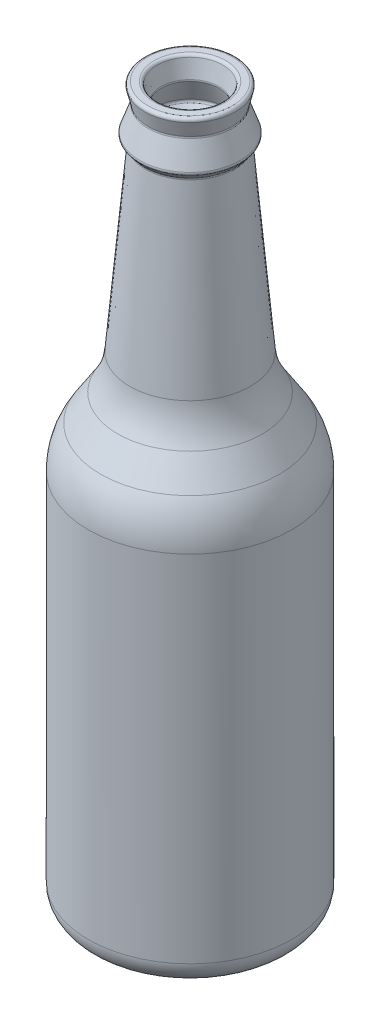
ISO-10303-21;
HEADER;
FILE_DESCRIPTION(('STEP AP214'),'2;1');
FILE_NAME('part.step','',(''),(''),'','','');
FILE_SCHEMA(('AUTOMOTIVE_DESIGN { 1 0 10303 214 1 1 1 1 }'));
ENDSEC;
DATA;
#1=APPLICATION_CONTEXT('core data for automotive mechanical design processes');
#2=APPLICATION_PROTOCOL_DEFINITION('international standard','automotive_design',2000,#1);
#3=PRODUCT_CONTEXT('',#1,'mechanical');
#4=PRODUCT('Part','Part','',(#3));
#5=PRODUCT_RELATED_PRODUCT_CATEGORY('part','',(#4));
#6=PRODUCT_DEFINITION_FORMATION('','',#4);
#7=PRODUCT_DEFINITION_CONTEXT('part definition',#1,'design');
#8=PRODUCT_DEFINITION('design','',#6,#7);
#9=PRODUCT_DEFINITION_SHAPE('','',#8);
#10=(LENGTH_UNIT() NAMED_UNIT(*) SI_UNIT(.MILLI.,.METRE.));
#11=(NAMED_UNIT(*) PLANE_ANGLE_UNIT() SI_UNIT($,.RADIAN.));
#12=(NAMED_UNIT(*) SI_UNIT($,.STERADIAN.) SOLID_ANGLE_UNIT());
#13=UNCERTAINTY_MEASURE_WITH_UNIT(LENGTH_MEASURE(1.E-05),#10,'distance_accuracy_value','');
#14=(GEOMETRIC_REPRESENTATION_CONTEXT(3) GLOBAL_UNCERTAINTY_ASSIGNED_CONTEXT((#13)) GLOBAL_UNIT_ASSIGNED_CONTEXT((#10,
#11,#12)) REPRESENTATION_CONTEXT('',''));
#15=CARTESIAN_POINT('',(0.,0.,0.));
#16=DIRECTION('',(0.,0.,1.));
#17=DIRECTION('',(1.,0.,0.));
#18=AXIS2_PLACEMENT_3D('',#15,#16,#17);
#19=CARTESIAN_POINT('',(0.,0.,0.));
#20=DIRECTION('',(0.,-1.,0.));
#21=DIRECTION('',(0.,0.,-1.));
#22=AXIS2_PLACEMENT_3D('',#19,#20,#21);
#23=PLANE('',#22);
#24=CARTESIAN_POINT('',(0.,0.,0.));
#25=DIRECTION('',(0.,-1.,0.));
#26=DIRECTION('',(0.,0.,-1.));
#27=AXIS2_PLACEMENT_3D('',#24,#25,#26);
#28=CIRCLE('',#27,25.1705232871505);
#29=CARTESIAN_POINT('',(0.,0.,-25.1705232871505));
#30=VERTEX_POINT('',#29);
#31=EDGE_CURVE('E99',#30,#30,#28,.T.);
#32=ORIENTED_EDGE('',*,*,#31,.T.);
#33=EDGE_LOOP('',(#32));
#34=FACE_BOUND('',#33,.T.);
#35=ADVANCED_FACE('F31',(#34),#23,.T.);
#36=CARTESIAN_POINT('',(0.,7.62038994454006,0.));
#37=DIRECTION('',(0.,-1.,0.));
#38=DIRECTION('',(0.,0.,-1.));
#39=AXIS2_PLACEMENT_3D('',#36,#37,#38);
#40=TOROIDAL_SURFACE('',#39,25.1705232871505,7.62038994454006);
#41=CARTESIAN_POINT('',(0.,7.62038994454006,0.));
#42=DIRECTION('',(0.,-1.,0.));
#43=DIRECTION('',(0.,0.,-1.));
#44=AXIS2_PLACEMENT_3D('',#41,#42,#43);
#45=CIRCLE('',#44,32.7909132316906);
#46=CARTESIAN_POINT('',(0.,7.62038994454006,-32.7909132316906));
#47=VERTEX_POINT('',#46);
#48=EDGE_CURVE('E102',#47,#47,#45,.T.);
#49=ORIENTED_EDGE('',*,*,#48,.T.);
#50=EDGE_LOOP('',(#49));
#51=FACE_BOUND('',#50,.T.);
#52=ORIENTED_EDGE('',*,*,#31,.F.);
#53=EDGE_LOOP('',(#52));
#54=FACE_BOUND('',#53,.T.);
#55=ADVANCED_FACE('F135',(#51,#54),#40,.T.);
#56=CARTESIAN_POINT('',(0.,0.,0.));
#57=DIRECTION('',(0.,-1.,0.));
#58=DIRECTION('',(0.,0.,-1.));
#59=AXIS2_PLACEMENT_3D('',#56,#57,#58);
#60=CYLINDRICAL_SURFACE('',#59,32.7909132316906);
#61=CARTESIAN_POINT('',(0.,121.979376149787,0.));
#62=DIRECTION('',(0.,1.,0.));
#63=DIRECTION('',(0.,0.,1.));
#64=AXIS2_PLACEMENT_3D('',#61,#62,#63);
#65=CIRCLE('',#64,32.7909132316906);
#66=CARTESIAN_POINT('',(0.,121.979376149787,32.7909132316906));
#67=VERTEX_POINT('',#66);
#68=EDGE_CURVE('E87',#67,#67,#65,.F.);
#69=ORIENTED_EDGE('',*,*,#68,.T.);
#70=EDGE_LOOP('',(#69));
#71=FACE_BOUND('',#70,.T.);
#72=ORIENTED_EDGE('',*,*,#48,.F.);
#73=EDGE_LOOP('',(#72));
#74=FACE_BOUND('',#73,.T.);
#75=ADVANCED_FACE('F141',(#71,#74),#60,.T.);
#76=CARTESIAN_POINT('',(0.,129.326876862975,0.));
#77=DIRECTION('',(0.,-1.,0.));
#78=DIRECTION('',(0.,0.,-1.));
#79=AXIS2_PLACEMENT_3D('',#76,#77,#78);
#80=CONICAL_SURFACE('',#79,32.7909132316906,0.571702275410155);
#81=CARTESIAN_POINT('',(0.,144.025421411682,0.));
#82=DIRECTION('',(0.,-1.,0.));
#83=DIRECTION('',(0.,0.,-1.));
#84=AXIS2_PLACEMENT_3D('',#81,#82,#83);
#85=CIRCLE('',#84,23.3342692233583);
#86=CARTESIAN_POINT('',(0.,144.025421411682,-23.3342692233583));
#87=VERTEX_POINT('',#86);
#88=EDGE_CURVE('E93',#87,#87,#85,.T.);
#89=ORIENTED_EDGE('',*,*,#88,.T.);
#90=EDGE_LOOP('',(#89));
#91=FACE_BOUND('',#90,.T.);
#92=CARTESIAN_POINT('',(0.,135.505986487605,0.));
#93=DIRECTION('',(0.,1.,0.));
#94=DIRECTION('',(0.,0.,1.));
#95=AXIS2_PLACEMENT_3D('',#92,#93,#94);
#96=CIRCLE('',#95,28.8154420675253);
#97=CARTESIAN_POINT('',(0.,135.505986487605,28.8154420675253));
#98=VERTEX_POINT('',#97);
#99=EDGE_CURVE('E96',#98,#98,#96,.T.);
#100=ORIENTED_EDGE('',*,*,#99,.T.);
#101=EDGE_LOOP('',(#100));
#102=FACE_BOUND('',#101,.T.);
#103=ADVANCED_FACE('F204',(#91,#102),#80,.T.);
#104=CARTESIAN_POINT('',(0.,149.216732243767,0.));
#105=DIRECTION('',(0.,-1.,0.));
#106=DIRECTION('',(0.,0.,-1.));
#107=AXIS2_PLACEMENT_3D('',#104,#105,#106);
#108=CONICAL_SURFACE('',#107,19.9943209507284,0.0875526867530574);
#109=CARTESIAN_POINT('',(0.,213.401447548994,0.));
#110=DIRECTION('',(0.,-1.,0.));
#111=DIRECTION('',(0.,0.,-1.));
#112=AXIS2_PLACEMENT_3D('',#109,#110,#111);
#113=CIRCLE('',#112,14.3603736918307);
#114=CARTESIAN_POINT('',(0.,213.401447548994,-14.3603736918307));
#115=VERTEX_POINT('',#114);
#116=EDGE_CURVE('E10',#115,#115,#113,.T.);
#117=ORIENTED_EDGE('',*,*,#116,.T.);
#118=EDGE_LOOP('',(#117));
#119=FACE_BOUND('',#118,.T.);
#120=CARTESIAN_POINT('',(0.,155.366009895557,0.));
#121=DIRECTION('',(0.,-1.,0.));
#122=DIRECTION('',(0.,0.,-1.));
#123=AXIS2_PLACEMENT_3D('',#120,#121,#122);
#124=CIRCLE('',#123,19.4545552790143);
#125=CARTESIAN_POINT('',(0.,155.366009895557,-19.4545552790143));
#126=VERTEX_POINT('',#125);
#127=EDGE_CURVE('E90',#126,#126,#124,.F.);
#128=ORIENTED_EDGE('',*,*,#127,.T.);
#129=EDGE_LOOP('',(#128));
#130=FACE_BOUND('',#129,.T.);
#131=ADVANCED_FACE('F199',(#119,#130),#108,.T.);
#132=CARTESIAN_POINT('',(0.,213.814074553801,0.));
#133=DIRECTION('',(0.,1.,0.));
#134=DIRECTION('',(0.,0.,1.));
#135=AXIS2_PLACEMENT_3D('',#132,#133,#134);
#136=CONICAL_SURFACE('',#135,14.3241544958488,0.697845476644383);
#137=CARTESIAN_POINT('',(0.,215.81799768994,0.));
#138=DIRECTION('',(0.,-1.,0.));
#139=DIRECTION('',(0.,0.,-1.));
#140=AXIS2_PLACEMENT_3D('',#137,#138,#139);
#141=CIRCLE('',#140,16.0046684790407);
#142=CARTESIAN_POINT('',(0.,215.81799768994,-16.0046684790407));
#143=VERTEX_POINT('',#142);
#144=EDGE_CURVE('E38',#143,#143,#141,.T.);
#145=ORIENTED_EDGE('',*,*,#144,.T.);
#146=EDGE_LOOP('',(#145));
#147=FACE_BOUND('',#146,.T.);
#148=CARTESIAN_POINT('',(0.,214.131456746089,0.));
#149=DIRECTION('',(0.,1.,0.));
#150=DIRECTION('',(0.,0.,1.));
#151=AXIS2_PLACEMENT_3D('',#148,#149,#150);
#152=CIRCLE('',#151,14.5903150099608);
#153=CARTESIAN_POINT('',(0.,214.131456746089,14.5903150099608));
#154=VERTEX_POINT('',#153);
#155=EDGE_CURVE('E42',#154,#154,#152,.T.);
#156=ORIENTED_EDGE('',*,*,#155,.T.);
#157=EDGE_LOOP('',(#156));
#158=FACE_BOUND('',#157,.T.);
#159=ADVANCED_FACE('F190',(#147,#158),#136,.T.);
#160=CARTESIAN_POINT('',(0.,216.255041385768,0.));
#161=DIRECTION('',(0.,-1.,0.));
#162=DIRECTION('',(0.,0.,-1.));
#163=AXIS2_PLACEMENT_3D('',#160,#161,#162);
#164=CONICAL_SURFACE('',#163,16.3711785656098,0.338869733029061);
#165=CARTESIAN_POINT('',(0.,224.356302094381,0.));
#166=DIRECTION('',(0.,-1.,0.));
#167=DIRECTION('',(0.,0.,-1.));
#168=AXIS2_PLACEMENT_3D('',#165,#166,#167);
#169=CIRCLE('',#168,13.5157621304972);
#170=CARTESIAN_POINT('',(0.,224.356302094381,-13.5157621304972));
#171=VERTEX_POINT('',#170);
#172=EDGE_CURVE('E46',#171,#171,#169,.T.);
#173=ORIENTED_EDGE('',*,*,#172,.T.);
#174=EDGE_LOOP('',(#173));
#175=FACE_BOUND('',#174,.T.);
#176=CARTESIAN_POINT('',(0.,216.79298732777,0.));
#177=DIRECTION('',(0.,1.,0.));
#178=DIRECTION('',(0.,0.,1.));
#179=AXIS2_PLACEMENT_3D('',#176,#177,#178);
#180=CIRCLE('',#179,16.1815710786712);
#181=CARTESIAN_POINT('',(0.,216.79298732777,16.1815710786712));
#182=VERTEX_POINT('',#181);
#183=EDGE_CURVE('E51',#182,#182,#180,.T.);
#184=ORIENTED_EDGE('',*,*,#183,.T.);
#185=EDGE_LOOP('',(#184));
#186=FACE_BOUND('',#185,.T.);
#187=ADVANCED_FACE('F188',(#175,#186),#164,.T.);
#188=CARTESIAN_POINT('',(0.,224.634729952167,0.));
#189=DIRECTION('',(0.,1.,0.));
#190=DIRECTION('',(0.,0.,1.));
#191=AXIS2_PLACEMENT_3D('',#188,#189,#190);
#192=CONICAL_SURFACE('',#191,13.4176258638456,0.235255330329999);
#193=CARTESIAN_POINT('',(0.,229.562736891709,0.));
#194=DIRECTION('',(0.,-1.,0.));
#195=DIRECTION('',(0.,0.,-1.));
#196=AXIS2_PLACEMENT_3D('',#193,#194,#195);
#197=CIRCLE('',#196,14.5988380169024);
#198=CARTESIAN_POINT('',(0.,229.562736891709,-14.5988380169024));
#199=VERTEX_POINT('',#198);
#200=EDGE_CURVE('E54',#199,#199,#197,.T.);
#201=ORIENTED_EDGE('',*,*,#200,.T.);
#202=EDGE_LOOP('',(#201));
#203=FACE_BOUND('',#202,.T.);
#204=CARTESIAN_POINT('',(0.,224.921814699601,0.));
#205=DIRECTION('',(0.,1.,0.));
#206=DIRECTION('',(0.,0.,1.));
#207=AXIS2_PLACEMENT_3D('',#204,#205,#206);
#208=CIRCLE('',#207,13.4864382654486);
#209=CARTESIAN_POINT('',(0.,224.921814699601,13.4864382654486));
#210=VERTEX_POINT('',#209);
#211=EDGE_CURVE('E57',#210,#210,#208,.T.);
#212=ORIENTED_EDGE('',*,*,#211,.T.);
#213=EDGE_LOOP('',(#212));
#214=FACE_BOUND('',#213,.T.);
#215=ADVANCED_FACE('F131',(#203,#214),#192,.T.);
#216=CARTESIAN_POINT('',(14.8944022147277,230.795828182036,0.));
#217=DIRECTION('',(0.,1.,0.));
#218=DIRECTION('',(0.,0.,1.));
#219=AXIS2_PLACEMENT_3D('',#216,#217,#218);
#220=PLANE('',#219);
#221=CARTESIAN_POINT('',(0.,230.795828182036,0.));
#222=DIRECTION('',(0.,1.,0.));
#223=DIRECTION('',(0.,0.,1.));
#224=AXIS2_PLACEMENT_3D('',#221,#222,#223);
#225=CIRCLE('',#224,11.5697324220468);
#226=CARTESIAN_POINT('',(0.,230.795828182036,11.5697324220468));
#227=VERTEX_POINT('',#226);
#228=EDGE_CURVE('E60',#227,#227,#225,.F.);
#229=ORIENTED_EDGE('',*,*,#228,.T.);
#230=EDGE_LOOP('',(#229));
#231=FACE_BOUND('',#230,.T.);
#232=CARTESIAN_POINT('',(0.,230.795828182036,0.));
#233=DIRECTION('',(0.,1.,0.));
#234=DIRECTION('',(0.,0.,1.));
#235=AXIS2_PLACEMENT_3D('',#232,#233,#234);
#236=CIRCLE('',#235,13.6263831591462);
#237=CARTESIAN_POINT('',(0.,230.795828182036,13.6263831591462));
#238=VERTEX_POINT('',#237);
#239=EDGE_CURVE('E63',#238,#238,#236,.T.);
#240=ORIENTED_EDGE('',*,*,#239,.T.);
#241=EDGE_LOOP('',(#240));
#242=FACE_BOUND('',#241,.T.);
#243=ADVANCED_FACE('F122',(#231,#242),#220,.T.);
#244=CARTESIAN_POINT('',(0.,4.,0.));
#245=DIRECTION('',(0.,-1.,0.));
#246=DIRECTION('',(0.,0.,-1.));
#247=AXIS2_PLACEMENT_3D('',#244,#245,#246);
#248=PLANE('',#247);
#249=CARTESIAN_POINT('',(0.,4.,0.));
#250=DIRECTION('',(0.,-1.,0.));
#251=DIRECTION('',(0.,0.,-1.));
#252=AXIS2_PLACEMENT_3D('',#249,#250,#251);
#253=CIRCLE('',#252,25.1705232871505);
#254=CARTESIAN_POINT('',(0.,4.,-25.1705232871505));
#255=VERTEX_POINT('',#254);
#256=EDGE_CURVE('E105',#255,#255,#253,.T.);
#257=ORIENTED_EDGE('',*,*,#256,.F.);
#258=EDGE_LOOP('',(#257));
#259=FACE_BOUND('',#258,.T.);
#260=ADVANCED_FACE('F120',(#259),#248,.F.);
#261=CARTESIAN_POINT('',(0.,7.62038994454006,0.));
#262=DIRECTION('',(0.,-1.,0.));
#263=DIRECTION('',(0.,0.,-1.));
#264=AXIS2_PLACEMENT_3D('',#261,#262,#263);
#265=TOROIDAL_SURFACE('',#264,25.1705232871505,3.62038994454006);
#266=CARTESIAN_POINT('',(0.,7.62038994454006,0.));
#267=DIRECTION('',(0.,-1.,0.));
#268=DIRECTION('',(0.,0.,-1.));
#269=AXIS2_PLACEMENT_3D('',#266,#267,#268);
#270=CIRCLE('',#269,28.7909132316906);
#271=CARTESIAN_POINT('',(0.,7.62038994454006,-28.7909132316906));
#272=VERTEX_POINT('',#271);
#273=EDGE_CURVE('E112',#272,#272,#270,.T.);
#274=ORIENTED_EDGE('',*,*,#273,.F.);
#275=EDGE_LOOP('',(#274));
#276=FACE_BOUND('',#275,.T.);
#277=ORIENTED_EDGE('',*,*,#256,.T.);
#278=EDGE_LOOP('',(#277));
#279=FACE_BOUND('',#278,.T.);
#280=ADVANCED_FACE('F118',(#276,#279),#265,.F.);
#281=CARTESIAN_POINT('',(0.,0.,0.));
#282=DIRECTION('',(0.,-1.,0.));
#283=DIRECTION('',(0.,0.,-1.));
#284=AXIS2_PLACEMENT_3D('',#281,#282,#283);
#285=CYLINDRICAL_SURFACE('',#284,28.7909132316906);
#286=CARTESIAN_POINT('',(0.,128.151276748865,0.));
#287=DIRECTION('',(0.,-1.,0.));
#288=DIRECTION('',(0.,0.,-1.));
#289=AXIS2_PLACEMENT_3D('',#286,#287,#288);
#290=CIRCLE('',#289,28.7909132316906);
#291=CARTESIAN_POINT('',(0.,128.151276748865,-28.7909132316906));
#292=VERTEX_POINT('',#291);
#293=EDGE_CURVE('E109',#292,#292,#290,.T.);
#294=ORIENTED_EDGE('',*,*,#293,.F.);
#295=EDGE_LOOP('',(#294));
#296=FACE_BOUND('',#295,.T.);
#297=ORIENTED_EDGE('',*,*,#273,.T.);
#298=EDGE_LOOP('',(#297));
#299=FACE_BOUND('',#298,.T.);
#300=ADVANCED_FACE('F128',(#296,#299),#285,.F.);
#301=CARTESIAN_POINT('',(0.,127.162619208924,0.));
#302=DIRECTION('',(0.,-1.,0.));
#303=DIRECTION('',(0.,0.,-1.));
#304=AXIS2_PLACEMENT_3D('',#301,#302,#303);
#305=CONICAL_SURFACE('',#304,29.426988617957,0.571702275410155);
#306=CARTESIAN_POINT('',(0.,147.883084322849,0.));
#307=DIRECTION('',(0.,-1.,0.));
#308=DIRECTION('',(0.,0.,-1.));
#309=AXIS2_PLACEMENT_3D('',#306,#307,#308);
#310=CIRCLE('',#309,16.096004613374);
#311=CARTESIAN_POINT('',(0.,147.883084322849,-16.096004613374));
#312=VERTEX_POINT('',#311);
#313=EDGE_CURVE('E106',#312,#312,#310,.T.);
#314=ORIENTED_EDGE('',*,*,#313,.F.);
#315=EDGE_LOOP('',(#314));
#316=FACE_BOUND('',#315,.T.);
#317=ORIENTED_EDGE('',*,*,#293,.T.);
#318=EDGE_LOOP('',(#317));
#319=FACE_BOUND('',#318,.T.);
#320=ADVANCED_FACE('F262',(#316,#319),#305,.F.);
#321=CARTESIAN_POINT('',(0.,148.866968747136,0.));
#322=DIRECTION('',(0.,-1.,0.));
#323=DIRECTION('',(0.,0.,-1.));
#324=AXIS2_PLACEMENT_3D('',#321,#322,#323);
#325=CONICAL_SURFACE('',#324,16.0096421058998,0.0875526867530574);
#326=CARTESIAN_POINT('',(0.,214.702192071592,0.));
#327=DIRECTION('',(0.,1.,0.));
#328=DIRECTION('',(0.,0.,1.));
#329=AXIS2_PLACEMENT_3D('',#326,#327,#328);
#330=CIRCLE('',#329,10.2308180630746);
#331=CARTESIAN_POINT('',(0.,214.702192071592,10.2308180630746));
#332=VERTEX_POINT('',#331);
#333=EDGE_CURVE('E66',#332,#332,#330,.T.);
#334=ORIENTED_EDGE('',*,*,#333,.T.);
#335=EDGE_LOOP('',(#334));
#336=FACE_BOUND('',#335,.T.);
#337=ORIENTED_EDGE('',*,*,#313,.T.);
#338=EDGE_LOOP('',(#337));
#339=FACE_BOUND('',#338,.T.);
#340=ADVANCED_FACE('F256',(#336,#339),#325,.F.);
#341=CARTESIAN_POINT('',(0.,216.384347845551,0.));
#342=DIRECTION('',(0.,1.,0.));
#343=DIRECTION('',(0.,0.,1.));
#344=AXIS2_PLACEMENT_3D('',#341,#342,#343);
#345=CONICAL_SURFACE('',#344,11.2592409235407,0.697845476644383);
#346=CARTESIAN_POINT('',(0.,216.64009619838,0.));
#347=DIRECTION('',(0.,1.,0.));
#348=DIRECTION('',(0.,0.,1.));
#349=AXIS2_PLACEMENT_3D('',#346,#347,#348);
#350=CIRCLE('',#349,11.4737145604565);
#351=CARTESIAN_POINT('',(0.,216.64009619838,11.4737145604565));
#352=VERTEX_POINT('',#351);
#353=EDGE_CURVE('E69',#352,#352,#350,.T.);
#354=ORIENTED_EDGE('',*,*,#353,.T.);
#355=EDGE_LOOP('',(#354));
#356=FACE_BOUND('',#355,.T.);
#357=CARTESIAN_POINT('',(0.,215.432201268687,0.));
#358=DIRECTION('',(0.,-1.,0.));
#359=DIRECTION('',(0.,0.,-1.));
#360=AXIS2_PLACEMENT_3D('',#357,#358,#359);
#361=CIRCLE('',#360,10.4607593812047);
#362=CARTESIAN_POINT('',(0.,215.432201268687,-10.4607593812047));
#363=VERTEX_POINT('',#362);
#364=EDGE_CURVE('E72',#363,#363,#361,.T.);
#365=ORIENTED_EDGE('',*,*,#364,.T.);
#366=EDGE_LOOP('',(#365));
#367=FACE_BOUND('',#366,.T.);
#368=ADVANCED_FACE('F261',(#356,#367),#345,.F.);
#369=CARTESIAN_POINT('',(0.,214.9253561262,0.));
#370=DIRECTION('',(0.,-1.,0.));
#371=DIRECTION('',(0.,0.,-1.));
#372=AXIS2_PLACEMENT_3D('',#369,#370,#371);
#373=CONICAL_SURFACE('',#372,12.5986545947799,0.338869733029061);
#374=CARTESIAN_POINT('',(0.,224.140328265956,0.));
#375=DIRECTION('',(0.,1.,0.));
#376=DIRECTION('',(0.,0.,1.));
#377=AXIS2_PLACEMENT_3D('',#374,#375,#376);
#378=CIRCLE('',#377,9.35069309306083);
#379=CARTESIAN_POINT('',(0.,224.140328265956,9.35069309306083));
#380=VERTEX_POINT('',#379);
#381=EDGE_CURVE('E75',#380,#380,#378,.T.);
#382=ORIENTED_EDGE('',*,*,#381,.T.);
#383=EDGE_LOOP('',(#382));
#384=FACE_BOUND('',#383,.T.);
#385=CARTESIAN_POINT('',(0.,217.615085836209,0.));
#386=DIRECTION('',(0.,-1.,0.));
#387=DIRECTION('',(0.,0.,-1.));
#388=AXIS2_PLACEMENT_3D('',#385,#386,#387);
#389=CIRCLE('',#388,11.6506171600869);
#390=CARTESIAN_POINT('',(0.,217.615085836209,-11.6506171600869));
#391=VERTEX_POINT('',#390);
#392=EDGE_CURVE('E78',#391,#391,#389,.T.);
#393=ORIENTED_EDGE('',*,*,#392,.T.);
#394=EDGE_LOOP('',(#393));
#395=FACE_BOUND('',#394,.T.);
#396=ADVANCED_FACE('F274',(#384,#395),#373,.F.);
#397=CARTESIAN_POINT('',(0.,225.567095113477,0.));
#398=DIRECTION('',(0.,1.,0.));
#399=DIRECTION('',(0.,0.,1.));
#400=AXIS2_PLACEMENT_3D('',#397,#398,#399);
#401=CONICAL_SURFACE('',#400,9.52780643282114,0.235255330329999);
#402=CARTESIAN_POINT('',(0.,224.705840871175,0.));
#403=DIRECTION('',(0.,-1.,0.));
#404=DIRECTION('',(0.,0.,-1.));
#405=AXIS2_PLACEMENT_3D('',#402,#403,#404);
#406=CIRCLE('',#405,9.32136922801219);
#407=CARTESIAN_POINT('',(0.,224.705840871175,-9.32136922801219));
#408=VERTEX_POINT('',#407);
#409=EDGE_CURVE('E81',#408,#408,#406,.T.);
#410=ORIENTED_EDGE('',*,*,#409,.T.);
#411=EDGE_LOOP('',(#410));
#412=FACE_BOUND('',#411,.T.);
#413=CARTESIAN_POINT('',(0.,230.028919472363,0.));
#414=DIRECTION('',(0.,1.,0.));
#415=DIRECTION('',(0.,0.,1.));
#416=AXIS2_PLACEMENT_3D('',#413,#414,#415);
#417=CIRCLE('',#416,10.5972775642907);
#418=CARTESIAN_POINT('',(0.,230.028919472363,10.5972775642907));
#419=VERTEX_POINT('',#418);
#420=EDGE_CURVE('E84',#419,#419,#417,.T.);
#421=ORIENTED_EDGE('',*,*,#420,.T.);
#422=EDGE_LOOP('',(#421));
#423=FACE_BOUND('',#422,.T.);
#424=ADVANCED_FACE('F150',(#412,#423),#401,.F.);
#425=CARTESIAN_POINT('',(0.,157.552031749499,0.));
#426=DIRECTION('',(0.,-1.,0.));
#427=DIRECTION('',(0.,0.,-1.));
#428=AXIS2_PLACEMENT_3D('',#425,#426,#427);
#429=TOROIDAL_SURFACE('',#428,44.358798059193,25.);
#430=ORIENTED_EDGE('',*,*,#127,.F.);
#431=EDGE_LOOP('',(#430));
#432=FACE_BOUND('',#431,.T.);
#433=ORIENTED_EDGE('',*,*,#88,.F.);
#434=EDGE_LOOP('',(#433));
#435=FACE_BOUND('',#434,.T.);
#436=ADVANCED_FACE('F146',(#432,#435),#429,.F.);
#437=CARTESIAN_POINT('',(0.,121.979376149787,0.));
#438=DIRECTION('',(0.,1.,0.));
#439=DIRECTION('',(0.,0.,1.));
#440=AXIS2_PLACEMENT_3D('',#437,#438,#439);
#441=DEGENERATE_TOROIDAL_SURFACE('',#440,7.7909132316906,25.,.T.);
#442=ORIENTED_EDGE('',*,*,#99,.F.);
#443=EDGE_LOOP('',(#442));
#444=FACE_BOUND('',#443,.T.);
#445=ORIENTED_EDGE('',*,*,#68,.F.);
#446=EDGE_LOOP('',(#445));
#447=FACE_BOUND('',#446,.T.);
#448=ADVANCED_FACE('F149',(#444,#447),#441,.T.);
#449=CARTESIAN_POINT('',(0.,224.472749580848,0.));
#450=DIRECTION('',(0.,1.,0.));
#451=DIRECTION('',(0.,0.,1.));
#452=AXIS2_PLACEMENT_3D('',#449,#450,#451);
#453=TOROIDAL_SURFACE('',#452,10.2938240857683,1.);
#454=ORIENTED_EDGE('',*,*,#381,.F.);
#455=EDGE_LOOP('',(#454));
#456=FACE_BOUND('',#455,.T.);
#457=ORIENTED_EDGE('',*,*,#409,.F.);
#458=EDGE_LOOP('',(#457));
#459=FACE_BOUND('',#458,.T.);
#460=ADVANCED_FACE('F154',(#456,#459),#453,.T.);
#461=CARTESIAN_POINT('',(0.,217.282664521317,0.));
#462=DIRECTION('',(0.,-1.,0.));
#463=DIRECTION('',(0.,0.,-1.));
#464=AXIS2_PLACEMENT_3D('',#461,#462,#463);
#465=TOROIDAL_SURFACE('',#464,10.7074861673795,1.);
#466=ORIENTED_EDGE('',*,*,#353,.F.);
#467=EDGE_LOOP('',(#466));
#468=FACE_BOUND('',#467,.T.);
#469=ORIENTED_EDGE('',*,*,#392,.F.);
#470=EDGE_LOOP('',(#469));
#471=FACE_BOUND('',#470,.T.);
#472=ADVANCED_FACE('F158',(#468,#471),#465,.F.);
#473=CARTESIAN_POINT('',(0.,214.78963294575,0.));
#474=DIRECTION('',(0.,1.,0.));
#475=DIRECTION('',(0.,0.,1.));
#476=AXIS2_PLACEMENT_3D('',#473,#474,#475);
#477=TOROIDAL_SURFACE('',#476,11.2269877742817,1.);
#478=ORIENTED_EDGE('',*,*,#333,.F.);
#479=EDGE_LOOP('',(#478));
#480=FACE_BOUND('',#479,.T.);
#481=ORIENTED_EDGE('',*,*,#364,.F.);
#482=EDGE_LOOP('',(#481));
#483=FACE_BOUND('',#482,.T.);
#484=ADVANCED_FACE('F162',(#480,#483),#477,.T.);
#485=CARTESIAN_POINT('',(0.,229.795828182036,0.));
#486=DIRECTION('',(0.,1.,0.));
#487=DIRECTION('',(0.,0.,1.));
#488=AXIS2_PLACEMENT_3D('',#485,#486,#487);
#489=TOROIDAL_SURFACE('',#488,11.5697324220468,1.);
#490=ORIENTED_EDGE('',*,*,#420,.F.);
#491=EDGE_LOOP('',(#490));
#492=FACE_BOUND('',#491,.T.);
#493=ORIENTED_EDGE('',*,*,#228,.F.);
#494=EDGE_LOOP('',(#493));
#495=FACE_BOUND('',#494,.T.);
#496=ADVANCED_FACE('F166',(#492,#495),#489,.T.);
#497=CARTESIAN_POINT('',(0.,229.795828182036,0.));
#498=DIRECTION('',(0.,1.,0.));
#499=DIRECTION('',(0.,0.,1.));
#500=AXIS2_PLACEMENT_3D('',#497,#498,#499);
#501=TOROIDAL_SURFACE('',#500,13.6263831591462,1.);
#502=ORIENTED_EDGE('',*,*,#239,.F.);
#503=EDGE_LOOP('',(#502));
#504=FACE_BOUND('',#503,.T.);
#505=ORIENTED_EDGE('',*,*,#200,.F.);
#506=EDGE_LOOP('',(#505));
#507=FACE_BOUND('',#506,.T.);
#508=ADVANCED_FACE('F170',(#504,#507),#501,.T.);
#509=CARTESIAN_POINT('',(0.,224.688723409273,0.));
#510=DIRECTION('',(0.,-1.,0.));
#511=DIRECTION('',(0.,0.,-1.));
#512=AXIS2_PLACEMENT_3D('',#509,#510,#511);
#513=TOROIDAL_SURFACE('',#512,14.4588931232047,1.);
#514=ORIENTED_EDGE('',*,*,#211,.F.);
#515=EDGE_LOOP('',(#514));
#516=FACE_BOUND('',#515,.T.);
#517=ORIENTED_EDGE('',*,*,#172,.F.);
#518=EDGE_LOOP('',(#517));
#519=FACE_BOUND('',#518,.T.);
#520=ADVANCED_FACE('F174',(#516,#519),#513,.F.);
#521=CARTESIAN_POINT('',(0.,216.460566012878,0.));
#522=DIRECTION('',(0.,1.,0.));
#523=DIRECTION('',(0.,0.,1.));
#524=AXIS2_PLACEMENT_3D('',#521,#522,#523);
#525=TOROIDAL_SURFACE('',#524,15.2384400859637,1.);
#526=ORIENTED_EDGE('',*,*,#183,.F.);
#527=EDGE_LOOP('',(#526));
#528=FACE_BOUND('',#527,.T.);
#529=ORIENTED_EDGE('',*,*,#144,.F.);
#530=EDGE_LOOP('',(#529));
#531=FACE_BOUND('',#530,.T.);
#532=ADVANCED_FACE('F177',(#528,#531),#525,.T.);
#533=CARTESIAN_POINT('',(0.,213.488888423151,0.));
#534=DIRECTION('',(0.,-1.,0.));
#535=DIRECTION('',(0.,0.,-1.));
#536=AXIS2_PLACEMENT_3D('',#533,#534,#535);
#537=TOROIDAL_SURFACE('',#536,15.3565434030378,1.);
#538=ORIENTED_EDGE('',*,*,#155,.F.);
#539=EDGE_LOOP('',(#538));
#540=FACE_BOUND('',#539,.T.);
#541=ORIENTED_EDGE('',*,*,#116,.F.);
#542=EDGE_LOOP('',(#541));
#543=FACE_BOUND('',#542,.T.);
#544=ADVANCED_FACE('F33',(#540,#543),#537,.F.);
#545=CLOSED_SHELL('',(#35,#55,#75,#103,#131,#159,#187,#215,#243,#260,#280,#300,#320,#340,#368,
#396,#424,#436,#448,#460,#472,#484,#496,#508,#520,#532,#544));
#546=MANIFOLD_SOLID_BREP('B2',#545);
#547=ADVANCED_BREP_SHAPE_REPRESENTATION('',(#18,#546),#14);
#548=SHAPE_DEFINITION_REPRESENTATION(#9,#547);
ENDSEC;
END-ISO-10303-21;
